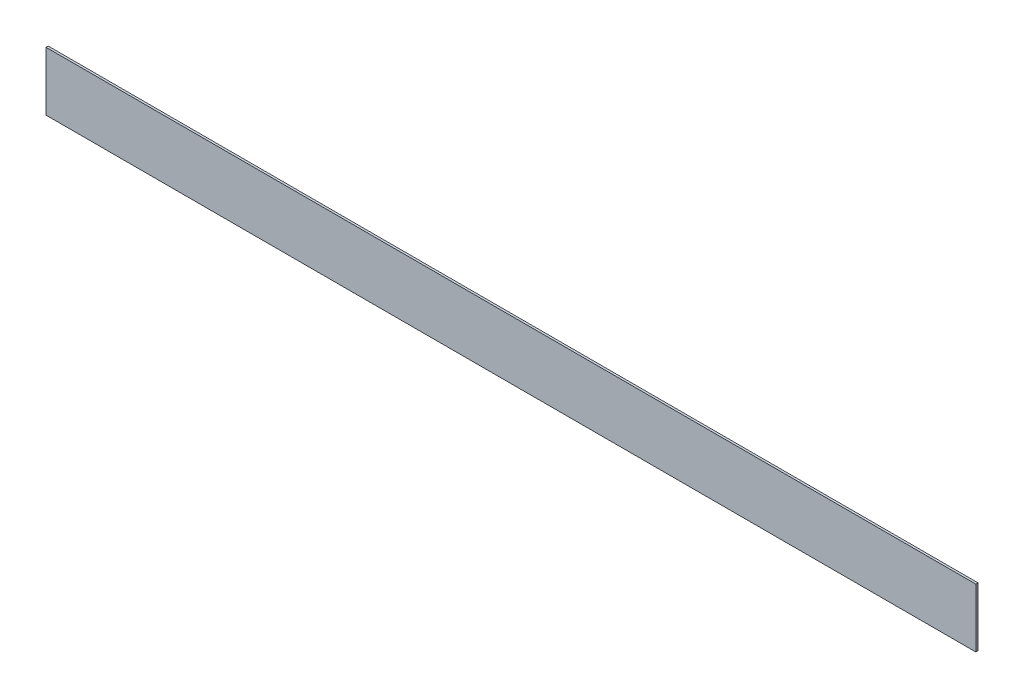
ISO-10303-21;
HEADER;
FILE_DESCRIPTION(('STEP AP214'),'2;1');
FILE_NAME('part.step','',(''),(''),'','','');
FILE_SCHEMA(('AUTOMOTIVE_DESIGN { 1 0 10303 214 1 1 1 1 }'));
ENDSEC;
DATA;
#1=APPLICATION_CONTEXT('core data for automotive mechanical design processes');
#2=APPLICATION_PROTOCOL_DEFINITION('international standard','automotive_design',2000,#1);
#3=PRODUCT_CONTEXT('',#1,'mechanical');
#4=PRODUCT('Part','Part','',(#3));
#5=PRODUCT_RELATED_PRODUCT_CATEGORY('part','',(#4));
#6=PRODUCT_DEFINITION_FORMATION('','',#4);
#7=PRODUCT_DEFINITION_CONTEXT('part definition',#1,'design');
#8=PRODUCT_DEFINITION('design','',#6,#7);
#9=PRODUCT_DEFINITION_SHAPE('','',#8);
#10=(LENGTH_UNIT() NAMED_UNIT(*) SI_UNIT(.MILLI.,.METRE.));
#11=(NAMED_UNIT(*) PLANE_ANGLE_UNIT() SI_UNIT($,.RADIAN.));
#12=(NAMED_UNIT(*) SI_UNIT($,.STERADIAN.) SOLID_ANGLE_UNIT());
#13=UNCERTAINTY_MEASURE_WITH_UNIT(LENGTH_MEASURE(1.E-05),#10,'distance_accuracy_value','');
#14=(GEOMETRIC_REPRESENTATION_CONTEXT(3) GLOBAL_UNCERTAINTY_ASSIGNED_CONTEXT((#13)) GLOBAL_UNIT_ASSIGNED_CONTEXT((#10,
#11,#12)) REPRESENTATION_CONTEXT('',''));
#15=CARTESIAN_POINT('',(0.,0.,0.));
#16=DIRECTION('',(0.,0.,1.));
#17=DIRECTION('',(1.,0.,0.));
#18=AXIS2_PLACEMENT_3D('',#15,#16,#17);
#19=CARTESIAN_POINT('',(213.5,13.5,1.));
#20=DIRECTION('',(-1.,0.,0.));
#21=DIRECTION('',(0.,0.,1.));
#22=AXIS2_PLACEMENT_3D('',#19,#20,#21);
#23=PLANE('',#22);
#24=DIRECTION('',(0.,1.,0.));
#25=VECTOR('',#24,1.);
#26=CARTESIAN_POINT('',(213.5,13.5,0.));
#27=LINE('',#26,#25);
#28=CARTESIAN_POINT('',(213.5,-13.5,0.));
#29=VERTEX_POINT('',#28);
#30=CARTESIAN_POINT('',(213.5,13.5,0.));
#31=VERTEX_POINT('',#30);
#32=EDGE_CURVE('E102',#29,#31,#27,.T.);
#33=ORIENTED_EDGE('',*,*,#32,.T.);
#34=DIRECTION('',(0.,0.,-1.));
#35=VECTOR('',#34,1.);
#36=CARTESIAN_POINT('',(213.5,13.5,1.));
#37=LINE('',#36,#35);
#38=CARTESIAN_POINT('',(213.5,13.5,1.));
#39=VERTEX_POINT('',#38);
#40=EDGE_CURVE('E11',#39,#31,#37,.T.);
#41=ORIENTED_EDGE('',*,*,#40,.F.);
#42=DIRECTION('',(0.,1.,0.));
#43=VECTOR('',#42,1.);
#44=CARTESIAN_POINT('',(213.5,13.5,1.));
#45=LINE('',#44,#43);
#46=CARTESIAN_POINT('',(213.5,-13.5,1.));
#47=VERTEX_POINT('',#46);
#48=EDGE_CURVE('E90',#47,#39,#45,.T.);
#49=ORIENTED_EDGE('',*,*,#48,.F.);
#50=DIRECTION('',(0.,0.,-1.));
#51=VECTOR('',#50,1.);
#52=CARTESIAN_POINT('',(213.5,-13.5,1.));
#53=LINE('',#52,#51);
#54=EDGE_CURVE('E98',#47,#29,#53,.T.);
#55=ORIENTED_EDGE('',*,*,#54,.T.);
#56=EDGE_LOOP('',(#33,#41,#49,#55));
#57=FACE_BOUND('',#56,.T.);
#58=ADVANCED_FACE('F39',(#57),#23,.F.);
#59=CARTESIAN_POINT('',(-213.5,13.5,1.));
#60=DIRECTION('',(0.,-1.,0.));
#61=DIRECTION('',(0.,0.,-1.));
#62=AXIS2_PLACEMENT_3D('',#59,#60,#61);
#63=PLANE('',#62);
#64=DIRECTION('',(-1.,0.,0.));
#65=VECTOR('',#64,1.);
#66=CARTESIAN_POINT('',(-213.5,13.5,0.));
#67=LINE('',#66,#65);
#68=CARTESIAN_POINT('',(-213.5,13.5,0.));
#69=VERTEX_POINT('',#68);
#70=EDGE_CURVE('E94',#31,#69,#67,.T.);
#71=ORIENTED_EDGE('',*,*,#70,.T.);
#72=DIRECTION('',(0.,0.,-1.));
#73=VECTOR('',#72,1.);
#74=CARTESIAN_POINT('',(-213.5,13.5,1.));
#75=LINE('',#74,#73);
#76=CARTESIAN_POINT('',(-213.5,13.5,1.));
#77=VERTEX_POINT('',#76);
#78=EDGE_CURVE('E47',#77,#69,#75,.T.);
#79=ORIENTED_EDGE('',*,*,#78,.F.);
#80=DIRECTION('',(-1.,0.,0.));
#81=VECTOR('',#80,1.);
#82=CARTESIAN_POINT('',(-213.5,13.5,1.));
#83=LINE('',#82,#81);
#84=EDGE_CURVE('E85',#39,#77,#83,.T.);
#85=ORIENTED_EDGE('',*,*,#84,.F.);
#86=ORIENTED_EDGE('',*,*,#40,.T.);
#87=EDGE_LOOP('',(#71,#79,#85,#86));
#88=FACE_BOUND('',#87,.T.);
#89=ADVANCED_FACE('F93',(#88),#63,.F.);
#90=CARTESIAN_POINT('',(-213.5,13.5,1.));
#91=DIRECTION('',(1.,0.,0.));
#92=DIRECTION('',(0.,0.,-1.));
#93=AXIS2_PLACEMENT_3D('',#90,#91,#92);
#94=PLANE('',#93);
#95=DIRECTION('',(0.,-1.,0.));
#96=VECTOR('',#95,1.);
#97=CARTESIAN_POINT('',(-213.5,13.5,0.));
#98=LINE('',#97,#96);
#99=CARTESIAN_POINT('',(-213.5,-13.5,0.));
#100=VERTEX_POINT('',#99);
#101=EDGE_CURVE('E72',#69,#100,#98,.T.);
#102=ORIENTED_EDGE('',*,*,#101,.T.);
#103=DIRECTION('',(0.,0.,-1.));
#104=VECTOR('',#103,1.);
#105=CARTESIAN_POINT('',(-213.5,-13.5,1.));
#106=LINE('',#105,#104);
#107=CARTESIAN_POINT('',(-213.5,-13.5,1.));
#108=VERTEX_POINT('',#107);
#109=EDGE_CURVE('E95',#108,#100,#106,.T.);
#110=ORIENTED_EDGE('',*,*,#109,.F.);
#111=DIRECTION('',(0.,-1.,0.));
#112=VECTOR('',#111,1.);
#113=CARTESIAN_POINT('',(-213.5,13.5,1.));
#114=LINE('',#113,#112);
#115=EDGE_CURVE('E88',#77,#108,#114,.T.);
#116=ORIENTED_EDGE('',*,*,#115,.F.);
#117=ORIENTED_EDGE('',*,*,#78,.T.);
#118=EDGE_LOOP('',(#102,#110,#116,#117));
#119=FACE_BOUND('',#118,.T.);
#120=ADVANCED_FACE('F96',(#119),#94,.F.);
#121=CARTESIAN_POINT('',(-213.5,-13.5,1.));
#122=DIRECTION('',(0.,1.,0.));
#123=DIRECTION('',(0.,0.,1.));
#124=AXIS2_PLACEMENT_3D('',#121,#122,#123);
#125=PLANE('',#124);
#126=DIRECTION('',(1.,0.,0.));
#127=VECTOR('',#126,1.);
#128=CARTESIAN_POINT('',(-213.5,-13.5,0.));
#129=LINE('',#128,#127);
#130=EDGE_CURVE('E78',#100,#29,#129,.T.);
#131=ORIENTED_EDGE('',*,*,#130,.T.);
#132=ORIENTED_EDGE('',*,*,#54,.F.);
#133=DIRECTION('',(1.,0.,0.));
#134=VECTOR('',#133,1.);
#135=CARTESIAN_POINT('',(-213.5,-13.5,1.));
#136=LINE('',#135,#134);
#137=EDGE_CURVE('E55',#108,#47,#136,.T.);
#138=ORIENTED_EDGE('',*,*,#137,.F.);
#139=ORIENTED_EDGE('',*,*,#109,.T.);
#140=EDGE_LOOP('',(#131,#132,#138,#139));
#141=FACE_BOUND('',#140,.T.);
#142=ADVANCED_FACE('F109',(#141),#125,.F.);
#143=CARTESIAN_POINT('',(0.,0.,1.));
#144=DIRECTION('',(0.,0.,1.));
#145=DIRECTION('',(1.,0.,0.));
#146=AXIS2_PLACEMENT_3D('',#143,#144,#145);
#147=PLANE('',#146);
#148=ORIENTED_EDGE('',*,*,#48,.T.);
#149=ORIENTED_EDGE('',*,*,#84,.T.);
#150=ORIENTED_EDGE('',*,*,#115,.T.);
#151=ORIENTED_EDGE('',*,*,#137,.T.);
#152=EDGE_LOOP('',(#148,#149,#150,#151));
#153=FACE_BOUND('',#152,.T.);
#154=ADVANCED_FACE('F86',(#153),#147,.T.);
#155=CARTESIAN_POINT('',(0.,0.,0.));
#156=DIRECTION('',(0.,0.,1.));
#157=DIRECTION('',(1.,0.,0.));
#158=AXIS2_PLACEMENT_3D('',#155,#156,#157);
#159=PLANE('',#158);
#160=ORIENTED_EDGE('',*,*,#32,.F.);
#161=ORIENTED_EDGE('',*,*,#130,.F.);
#162=ORIENTED_EDGE('',*,*,#101,.F.);
#163=ORIENTED_EDGE('',*,*,#70,.F.);
#164=EDGE_LOOP('',(#160,#161,#162,#163));
#165=FACE_BOUND('',#164,.T.);
#166=ADVANCED_FACE('F112',(#165),#159,.F.);
#167=CLOSED_SHELL('',(#58,#89,#120,#142,#154,#166));
#168=MANIFOLD_SOLID_BREP('B2',#167);
#169=ADVANCED_BREP_SHAPE_REPRESENTATION('',(#18,#168),#14);
#170=SHAPE_DEFINITION_REPRESENTATION(#9,#169);
ENDSEC;
END-ISO-10303-21;
